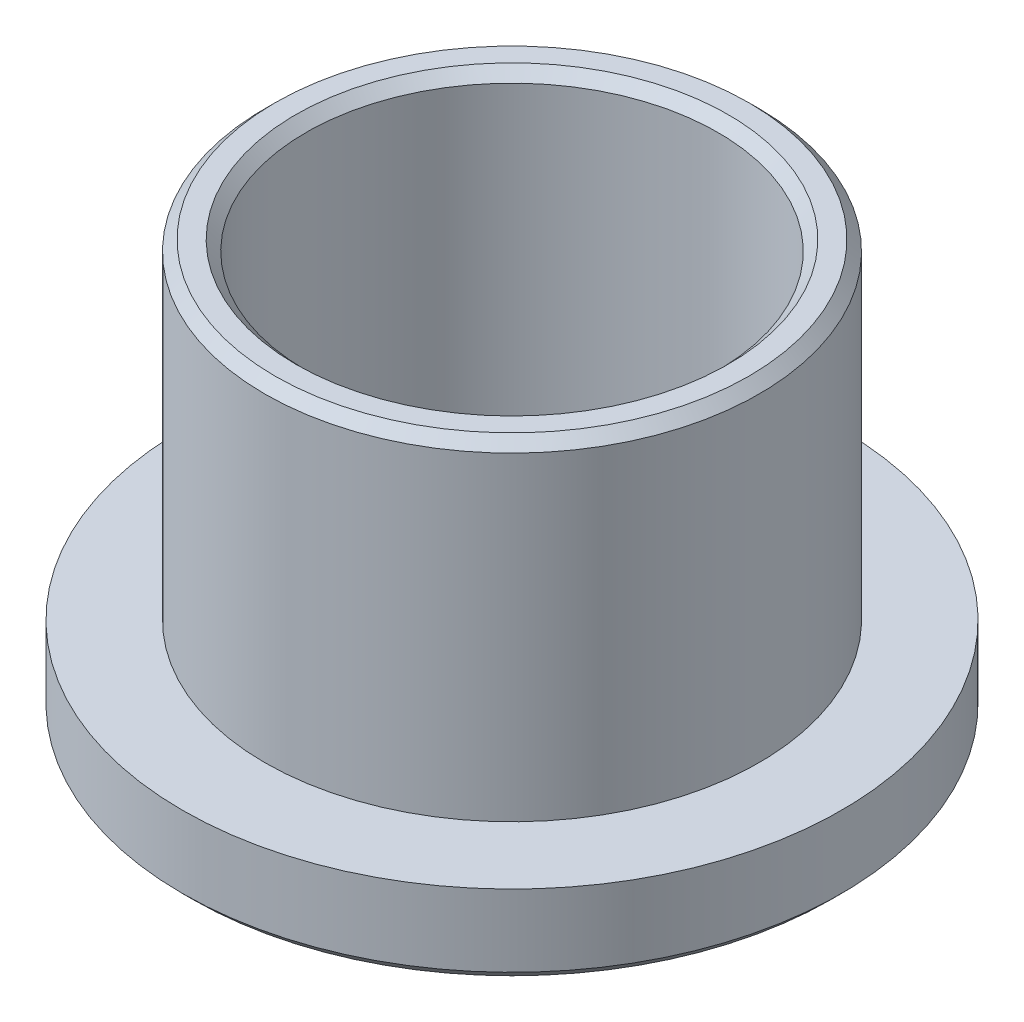
ISO-10303-21;
HEADER;
FILE_DESCRIPTION(('STEP AP214'),'2;1');
FILE_NAME('part.step','',(''),(''),'','','');
FILE_SCHEMA(('AUTOMOTIVE_DESIGN { 1 0 10303 214 1 1 1 1 }'));
ENDSEC;
DATA;
#1=APPLICATION_CONTEXT('core data for automotive mechanical design processes');
#2=APPLICATION_PROTOCOL_DEFINITION('international standard','automotive_design',2000,#1);
#3=PRODUCT_CONTEXT('',#1,'mechanical');
#4=PRODUCT('Part','Part','',(#3));
#5=PRODUCT_RELATED_PRODUCT_CATEGORY('part','',(#4));
#6=PRODUCT_DEFINITION_FORMATION('','',#4);
#7=PRODUCT_DEFINITION_CONTEXT('part definition',#1,'design');
#8=PRODUCT_DEFINITION('design','',#6,#7);
#9=PRODUCT_DEFINITION_SHAPE('','',#8);
#10=(LENGTH_UNIT() NAMED_UNIT(*) SI_UNIT(.MILLI.,.METRE.));
#11=(NAMED_UNIT(*) PLANE_ANGLE_UNIT() SI_UNIT($,.RADIAN.));
#12=(NAMED_UNIT(*) SI_UNIT($,.STERADIAN.) SOLID_ANGLE_UNIT());
#13=UNCERTAINTY_MEASURE_WITH_UNIT(LENGTH_MEASURE(1.E-05),#10,'distance_accuracy_value','');
#14=(GEOMETRIC_REPRESENTATION_CONTEXT(3) GLOBAL_UNCERTAINTY_ASSIGNED_CONTEXT((#13)) GLOBAL_UNIT_ASSIGNED_CONTEXT((#10,
#11,#12)) REPRESENTATION_CONTEXT('',''));
#15=CARTESIAN_POINT('',(0.,0.,0.));
#16=DIRECTION('',(0.,0.,1.));
#17=DIRECTION('',(1.,0.,0.));
#18=AXIS2_PLACEMENT_3D('',#15,#16,#17);
#19=CARTESIAN_POINT('',(0.,2.,0.));
#20=DIRECTION('',(0.,1.,0.));
#21=DIRECTION('',(0.,0.,1.));
#22=AXIS2_PLACEMENT_3D('',#19,#20,#21);
#23=PLANE('',#22);
#24=CARTESIAN_POINT('',(0.,2.,0.));
#25=DIRECTION('',(0.,1.,0.));
#26=DIRECTION('',(0.,0.,1.));
#27=AXIS2_PLACEMENT_3D('',#24,#25,#26);
#28=CIRCLE('',#27,8.);
#29=CARTESIAN_POINT('',(0.,2.,8.));
#30=VERTEX_POINT('',#29);
#31=EDGE_CURVE('E83',#30,#30,#28,.T.);
#32=ORIENTED_EDGE('',*,*,#31,.T.);
#33=EDGE_LOOP('',(#32));
#34=FACE_BOUND('',#33,.T.);
#35=CARTESIAN_POINT('',(0.,2.,0.));
#36=DIRECTION('',(0.,1.,0.));
#37=DIRECTION('',(0.,0.,1.));
#38=AXIS2_PLACEMENT_3D('',#35,#36,#37);
#39=CIRCLE('',#38,6.);
#40=CARTESIAN_POINT('',(0.,2.,6.));
#41=VERTEX_POINT('',#40);
#42=EDGE_CURVE('E87',#41,#41,#39,.T.);
#43=ORIENTED_EDGE('',*,*,#42,.F.);
#44=EDGE_LOOP('',(#43));
#45=FACE_BOUND('',#44,.T.);
#46=ADVANCED_FACE('F40',(#34,#45),#23,.T.);
#47=CARTESIAN_POINT('',(0.,0.,0.));
#48=DIRECTION('',(0.,1.,0.));
#49=DIRECTION('',(0.,0.,1.));
#50=AXIS2_PLACEMENT_3D('',#47,#48,#49);
#51=PLANE('',#50);
#52=CARTESIAN_POINT('',(0.,0.,0.));
#53=DIRECTION('',(0.,1.,0.));
#54=DIRECTION('',(0.,0.,1.));
#55=AXIS2_PLACEMENT_3D('',#52,#53,#54);
#56=CIRCLE('',#55,5.25);
#57=CARTESIAN_POINT('',(0.,0.,5.25));
#58=VERTEX_POINT('',#57);
#59=EDGE_CURVE('E75',#58,#58,#56,.T.);
#60=ORIENTED_EDGE('',*,*,#59,.T.);
#61=EDGE_LOOP('',(#60));
#62=FACE_BOUND('',#61,.T.);
#63=CARTESIAN_POINT('',(0.,0.,0.));
#64=DIRECTION('',(0.,1.,0.));
#65=DIRECTION('',(0.,0.,1.));
#66=AXIS2_PLACEMENT_3D('',#63,#64,#65);
#67=CIRCLE('',#66,7.75);
#68=CARTESIAN_POINT('',(0.,0.,7.75));
#69=VERTEX_POINT('',#68);
#70=EDGE_CURVE('E79',#69,#69,#67,.F.);
#71=ORIENTED_EDGE('',*,*,#70,.T.);
#72=EDGE_LOOP('',(#71));
#73=FACE_BOUND('',#72,.T.);
#74=ADVANCED_FACE('F96',(#62,#73),#51,.F.);
#75=CARTESIAN_POINT('',(0.,2.,0.));
#76=DIRECTION('',(0.,-1.,0.));
#77=DIRECTION('',(0.,0.,-1.));
#78=AXIS2_PLACEMENT_3D('',#75,#76,#77);
#79=CYLINDRICAL_SURFACE('',#78,8.);
#80=CARTESIAN_POINT('',(0.,0.250000000000002,0.));
#81=DIRECTION('',(0.,1.,0.));
#82=DIRECTION('',(0.,0.,1.));
#83=AXIS2_PLACEMENT_3D('',#80,#81,#82);
#84=CIRCLE('',#83,8.);
#85=CARTESIAN_POINT('',(0.,0.250000000000002,8.));
#86=VERTEX_POINT('',#85);
#87=EDGE_CURVE('E61',#86,#86,#84,.T.);
#88=ORIENTED_EDGE('',*,*,#87,.T.);
#89=EDGE_LOOP('',(#88));
#90=FACE_BOUND('',#89,.T.);
#91=ORIENTED_EDGE('',*,*,#31,.F.);
#92=EDGE_LOOP('',(#91));
#93=FACE_BOUND('',#92,.T.);
#94=ADVANCED_FACE('F102',(#90,#93),#79,.T.);
#95=CARTESIAN_POINT('',(0.,2.,0.));
#96=DIRECTION('',(0.,-1.,0.));
#97=DIRECTION('',(0.,0.,-1.));
#98=AXIS2_PLACEMENT_3D('',#95,#96,#97);
#99=CYLINDRICAL_SURFACE('',#98,5.);
#100=CARTESIAN_POINT('',(0.,0.249999999999999,0.));
#101=DIRECTION('',(0.,1.,0.));
#102=DIRECTION('',(0.,0.,1.));
#103=AXIS2_PLACEMENT_3D('',#100,#101,#102);
#104=CIRCLE('',#103,5.);
#105=CARTESIAN_POINT('',(0.,0.249999999999999,5.));
#106=VERTEX_POINT('',#105);
#107=EDGE_CURVE('E67',#106,#106,#104,.F.);
#108=ORIENTED_EDGE('',*,*,#107,.T.);
#109=EDGE_LOOP('',(#108));
#110=FACE_BOUND('',#109,.T.);
#111=CARTESIAN_POINT('',(0.,9.75,0.));
#112=DIRECTION('',(0.,1.,0.));
#113=DIRECTION('',(0.,0.,1.));
#114=AXIS2_PLACEMENT_3D('',#111,#112,#113);
#115=CIRCLE('',#114,5.);
#116=CARTESIAN_POINT('',(0.,9.75,5.));
#117=VERTEX_POINT('',#116);
#118=EDGE_CURVE('E71',#117,#117,#115,.T.);
#119=ORIENTED_EDGE('',*,*,#118,.T.);
#120=EDGE_LOOP('',(#119));
#121=FACE_BOUND('',#120,.T.);
#122=ADVANCED_FACE('F106',(#110,#121),#99,.F.);
#123=CARTESIAN_POINT('',(0.,10.,0.));
#124=DIRECTION('',(0.,1.,0.));
#125=DIRECTION('',(0.,0.,1.));
#126=AXIS2_PLACEMENT_3D('',#123,#124,#125);
#127=PLANE('',#126);
#128=CARTESIAN_POINT('',(0.,10.,0.));
#129=DIRECTION('',(0.,1.,0.));
#130=DIRECTION('',(0.,0.,1.));
#131=AXIS2_PLACEMENT_3D('',#128,#129,#130);
#132=CIRCLE('',#131,5.25);
#133=CARTESIAN_POINT('',(0.,10.,5.25));
#134=VERTEX_POINT('',#133);
#135=EDGE_CURVE('E49',#134,#134,#132,.F.);
#136=ORIENTED_EDGE('',*,*,#135,.T.);
#137=EDGE_LOOP('',(#136));
#138=FACE_BOUND('',#137,.T.);
#139=CARTESIAN_POINT('',(0.,10.,0.));
#140=DIRECTION('',(0.,1.,0.));
#141=DIRECTION('',(0.,0.,1.));
#142=AXIS2_PLACEMENT_3D('',#139,#140,#141);
#143=CIRCLE('',#142,5.75);
#144=CARTESIAN_POINT('',(0.,10.,5.75));
#145=VERTEX_POINT('',#144);
#146=EDGE_CURVE('E55',#145,#145,#143,.T.);
#147=ORIENTED_EDGE('',*,*,#146,.T.);
#148=EDGE_LOOP('',(#147));
#149=FACE_BOUND('',#148,.T.);
#150=ADVANCED_FACE('F139',(#138,#149),#127,.T.);
#151=CARTESIAN_POINT('',(0.,10.,0.));
#152=DIRECTION('',(0.,-1.,0.));
#153=DIRECTION('',(0.,0.,-1.));
#154=AXIS2_PLACEMENT_3D('',#151,#152,#153);
#155=CYLINDRICAL_SURFACE('',#154,6.);
#156=CARTESIAN_POINT('',(0.,9.75,0.));
#157=DIRECTION('',(0.,1.,0.));
#158=DIRECTION('',(0.,0.,1.));
#159=AXIS2_PLACEMENT_3D('',#156,#157,#158);
#160=CIRCLE('',#159,6.);
#161=CARTESIAN_POINT('',(0.,9.75,6.));
#162=VERTEX_POINT('',#161);
#163=EDGE_CURVE('E10',#162,#162,#160,.F.);
#164=ORIENTED_EDGE('',*,*,#163,.T.);
#165=EDGE_LOOP('',(#164));
#166=FACE_BOUND('',#165,.T.);
#167=ORIENTED_EDGE('',*,*,#42,.T.);
#168=EDGE_LOOP('',(#167));
#169=FACE_BOUND('',#168,.T.);
#170=ADVANCED_FACE('F93',(#166,#169),#155,.T.);
#171=CARTESIAN_POINT('',(0.,0.,0.));
#172=DIRECTION('',(0.,-1.,0.));
#173=DIRECTION('',(0.,0.,-1.));
#174=AXIS2_PLACEMENT_3D('',#171,#172,#173);
#175=CONICAL_SURFACE('',#174,5.25,0.785398163397445);
#176=ORIENTED_EDGE('',*,*,#107,.F.);
#177=EDGE_LOOP('',(#176));
#178=FACE_BOUND('',#177,.T.);
#179=ORIENTED_EDGE('',*,*,#59,.F.);
#180=EDGE_LOOP('',(#179));
#181=FACE_BOUND('',#180,.T.);
#182=ADVANCED_FACE('F113',(#178,#181),#175,.F.);
#183=CARTESIAN_POINT('',(0.,0.250000000000002,0.));
#184=DIRECTION('',(0.,1.,0.));
#185=DIRECTION('',(0.,0.,1.));
#186=AXIS2_PLACEMENT_3D('',#183,#184,#185);
#187=CONICAL_SURFACE('',#186,8.,0.785398163397445);
#188=ORIENTED_EDGE('',*,*,#70,.F.);
#189=EDGE_LOOP('',(#188));
#190=FACE_BOUND('',#189,.T.);
#191=ORIENTED_EDGE('',*,*,#87,.F.);
#192=EDGE_LOOP('',(#191));
#193=FACE_BOUND('',#192,.T.);
#194=ADVANCED_FACE('F119',(#190,#193),#187,.T.);
#195=CARTESIAN_POINT('',(0.,9.75,0.));
#196=DIRECTION('',(0.,1.,0.));
#197=DIRECTION('',(0.,0.,1.));
#198=AXIS2_PLACEMENT_3D('',#195,#196,#197);
#199=CONICAL_SURFACE('',#198,5.,0.785398163397457);
#200=ORIENTED_EDGE('',*,*,#135,.F.);
#201=EDGE_LOOP('',(#200));
#202=FACE_BOUND('',#201,.T.);
#203=ORIENTED_EDGE('',*,*,#118,.F.);
#204=EDGE_LOOP('',(#203));
#205=FACE_BOUND('',#204,.T.);
#206=ADVANCED_FACE('F125',(#202,#205),#199,.F.);
#207=CARTESIAN_POINT('',(0.,10.,0.));
#208=DIRECTION('',(0.,-1.,0.));
#209=DIRECTION('',(0.,0.,-1.));
#210=AXIS2_PLACEMENT_3D('',#207,#208,#209);
#211=CONICAL_SURFACE('',#210,5.75,0.785398163397443);
#212=ORIENTED_EDGE('',*,*,#163,.F.);
#213=EDGE_LOOP('',(#212));
#214=FACE_BOUND('',#213,.T.);
#215=ORIENTED_EDGE('',*,*,#146,.F.);
#216=EDGE_LOOP('',(#215));
#217=FACE_BOUND('',#216,.T.);
#218=ADVANCED_FACE('F43',(#214,#217),#211,.T.);
#219=CLOSED_SHELL('',(#46,#74,#94,#122,#150,#170,#182,#194,#206,#218));
#220=MANIFOLD_SOLID_BREP('B2',#219);
#221=ADVANCED_BREP_SHAPE_REPRESENTATION('',(#18,#220),#14);
#222=SHAPE_DEFINITION_REPRESENTATION(#9,#221);
ENDSEC;
END-ISO-10303-21;
